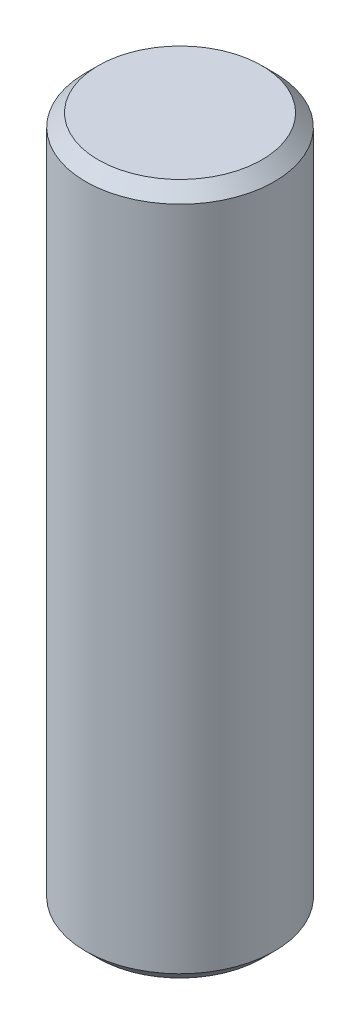
ISO-10303-21;
HEADER;
FILE_DESCRIPTION(('STEP AP214'),'2;1');
FILE_NAME('part.step','',(''),(''),'','','');
FILE_SCHEMA(('AUTOMOTIVE_DESIGN { 1 0 10303 214 1 1 1 1 }'));
ENDSEC;
DATA;
#1=APPLICATION_CONTEXT('core data for automotive mechanical design processes');
#2=APPLICATION_PROTOCOL_DEFINITION('international standard','automotive_design',2000,#1);
#3=PRODUCT_CONTEXT('',#1,'mechanical');
#4=PRODUCT('Part','Part','',(#3));
#5=PRODUCT_RELATED_PRODUCT_CATEGORY('part','',(#4));
#6=PRODUCT_DEFINITION_FORMATION('','',#4);
#7=PRODUCT_DEFINITION_CONTEXT('part definition',#1,'design');
#8=PRODUCT_DEFINITION('design','',#6,#7);
#9=PRODUCT_DEFINITION_SHAPE('','',#8);
#10=(LENGTH_UNIT() NAMED_UNIT(*) SI_UNIT(.MILLI.,.METRE.));
#11=(NAMED_UNIT(*) PLANE_ANGLE_UNIT() SI_UNIT($,.RADIAN.));
#12=(NAMED_UNIT(*) SI_UNIT($,.STERADIAN.) SOLID_ANGLE_UNIT());
#13=UNCERTAINTY_MEASURE_WITH_UNIT(LENGTH_MEASURE(1.E-05),#10,'distance_accuracy_value','');
#14=(GEOMETRIC_REPRESENTATION_CONTEXT(3) GLOBAL_UNCERTAINTY_ASSIGNED_CONTEXT((#13)) GLOBAL_UNIT_ASSIGNED_CONTEXT((#10,
#11,#12)) REPRESENTATION_CONTEXT('',''));
#15=CARTESIAN_POINT('',(0.,0.,0.));
#16=DIRECTION('',(0.,0.,1.));
#17=DIRECTION('',(1.,0.,0.));
#18=AXIS2_PLACEMENT_3D('',#15,#16,#17);
#19=CARTESIAN_POINT('',(0.,22.,0.));
#20=DIRECTION('',(0.,-1.,0.));
#21=DIRECTION('',(0.,0.,-1.));
#22=AXIS2_PLACEMENT_3D('',#19,#20,#21);
#23=CYLINDRICAL_SURFACE('',#22,3.);
#24=CARTESIAN_POINT('',(0.,0.400000000000005,0.));
#25=DIRECTION('',(0.,1.,0.));
#26=DIRECTION('',(0.,0.,1.));
#27=AXIS2_PLACEMENT_3D('',#24,#25,#26);
#28=CIRCLE('',#27,3.);
#29=CARTESIAN_POINT('',(0.,0.400000000000005,3.));
#30=VERTEX_POINT('',#29);
#31=EDGE_CURVE('E44',#30,#30,#28,.T.);
#32=ORIENTED_EDGE('',*,*,#31,.T.);
#33=EDGE_LOOP('',(#32));
#34=FACE_BOUND('',#33,.T.);
#35=CARTESIAN_POINT('',(0.,21.6,0.));
#36=DIRECTION('',(0.,1.,0.));
#37=DIRECTION('',(0.,0.,1.));
#38=AXIS2_PLACEMENT_3D('',#35,#36,#37);
#39=CIRCLE('',#38,3.);
#40=CARTESIAN_POINT('',(0.,21.6,3.));
#41=VERTEX_POINT('',#40);
#42=EDGE_CURVE('E48',#41,#41,#39,.F.);
#43=ORIENTED_EDGE('',*,*,#42,.T.);
#44=EDGE_LOOP('',(#43));
#45=FACE_BOUND('',#44,.T.);
#46=ADVANCED_FACE('F32',(#34,#45),#23,.T.);
#47=CARTESIAN_POINT('',(0.,22.,0.));
#48=DIRECTION('',(0.,1.,0.));
#49=DIRECTION('',(0.,0.,1.));
#50=AXIS2_PLACEMENT_3D('',#47,#48,#49);
#51=PLANE('',#50);
#52=CARTESIAN_POINT('',(0.,22.,0.));
#53=DIRECTION('',(0.,1.,0.));
#54=DIRECTION('',(0.,0.,1.));
#55=AXIS2_PLACEMENT_3D('',#52,#53,#54);
#56=CIRCLE('',#55,2.6);
#57=CARTESIAN_POINT('',(0.,22.,2.6));
#58=VERTEX_POINT('',#57);
#59=EDGE_CURVE('E10',#58,#58,#56,.T.);
#60=ORIENTED_EDGE('',*,*,#59,.T.);
#61=EDGE_LOOP('',(#60));
#62=FACE_BOUND('',#61,.T.);
#63=ADVANCED_FACE('F64',(#62),#51,.T.);
#64=CARTESIAN_POINT('',(0.,0.,0.));
#65=DIRECTION('',(0.,1.,0.));
#66=DIRECTION('',(0.,0.,1.));
#67=AXIS2_PLACEMENT_3D('',#64,#65,#66);
#68=PLANE('',#67);
#69=CARTESIAN_POINT('',(0.,0.,0.));
#70=DIRECTION('',(0.,1.,0.));
#71=DIRECTION('',(0.,0.,1.));
#72=AXIS2_PLACEMENT_3D('',#69,#70,#71);
#73=CIRCLE('',#72,2.59999999999999);
#74=CARTESIAN_POINT('',(0.,0.,2.59999999999999));
#75=VERTEX_POINT('',#74);
#76=EDGE_CURVE('E40',#75,#75,#73,.F.);
#77=ORIENTED_EDGE('',*,*,#76,.T.);
#78=EDGE_LOOP('',(#77));
#79=FACE_BOUND('',#78,.T.);
#80=ADVANCED_FACE('F61',(#79),#68,.F.);
#81=CARTESIAN_POINT('',(0.,0.400000000000005,0.));
#82=DIRECTION('',(0.,1.,0.));
#83=DIRECTION('',(0.,0.,1.));
#84=AXIS2_PLACEMENT_3D('',#81,#82,#83);
#85=CONICAL_SURFACE('',#84,3.,0.785398163397451);
#86=ORIENTED_EDGE('',*,*,#76,.F.);
#87=EDGE_LOOP('',(#86));
#88=FACE_BOUND('',#87,.T.);
#89=ORIENTED_EDGE('',*,*,#31,.F.);
#90=EDGE_LOOP('',(#89));
#91=FACE_BOUND('',#90,.T.);
#92=ADVANCED_FACE('F57',(#88,#91),#85,.T.);
#93=CARTESIAN_POINT('',(0.,22.,0.));
#94=DIRECTION('',(0.,-1.,0.));
#95=DIRECTION('',(0.,0.,-1.));
#96=AXIS2_PLACEMENT_3D('',#93,#94,#95);
#97=CONICAL_SURFACE('',#96,2.6,0.78539816339745);
#98=ORIENTED_EDGE('',*,*,#42,.F.);
#99=EDGE_LOOP('',(#98));
#100=FACE_BOUND('',#99,.T.);
#101=ORIENTED_EDGE('',*,*,#59,.F.);
#102=EDGE_LOOP('',(#101));
#103=FACE_BOUND('',#102,.T.);
#104=ADVANCED_FACE('F35',(#100,#103),#97,.T.);
#105=CLOSED_SHELL('',(#46,#63,#80,#92,#104));
#106=MANIFOLD_SOLID_BREP('B2',#105);
#107=ADVANCED_BREP_SHAPE_REPRESENTATION('',(#18,#106),#14);
#108=SHAPE_DEFINITION_REPRESENTATION(#9,#107);
ENDSEC;
END-ISO-10303-21;
